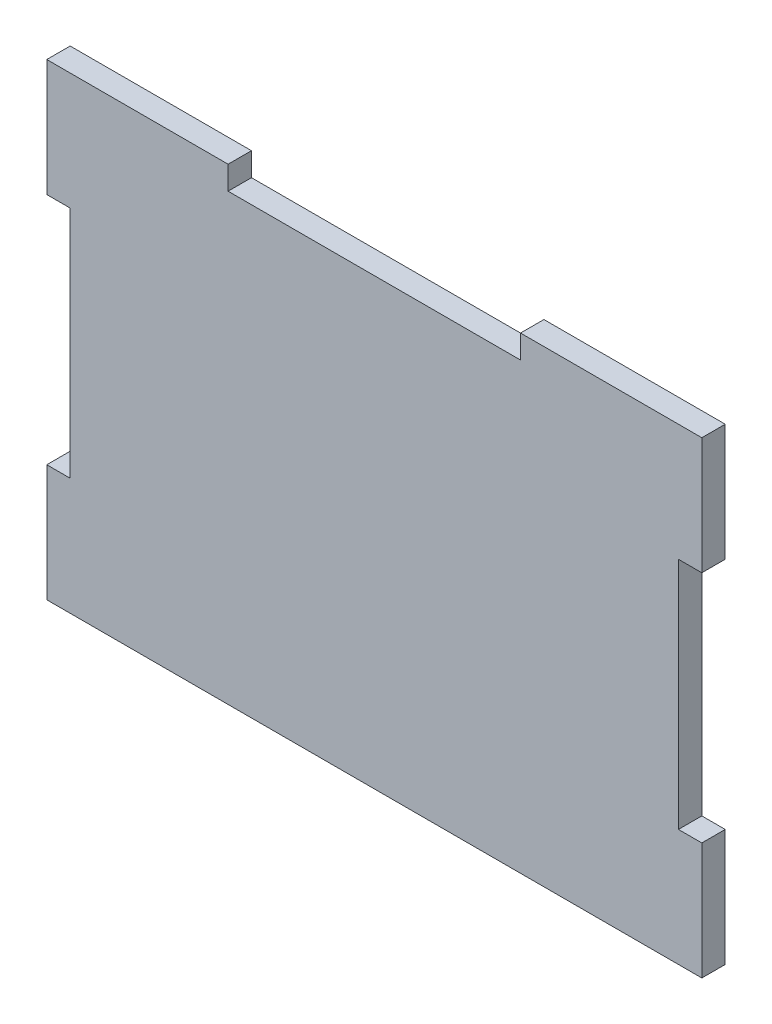
ISO-10303-21;
HEADER;
FILE_DESCRIPTION(('STEP AP214'),'2;1');
FILE_NAME('part.step','',(''),(''),'','','');
FILE_SCHEMA(('AUTOMOTIVE_DESIGN { 1 0 10303 214 1 1 1 1 }'));
ENDSEC;
DATA;
#1=APPLICATION_CONTEXT('core data for automotive mechanical design processes');
#2=APPLICATION_PROTOCOL_DEFINITION('international standard','automotive_design',2000,#1);
#3=PRODUCT_CONTEXT('',#1,'mechanical');
#4=PRODUCT('Part','Part','',(#3));
#5=PRODUCT_RELATED_PRODUCT_CATEGORY('part','',(#4));
#6=PRODUCT_DEFINITION_FORMATION('','',#4);
#7=PRODUCT_DEFINITION_CONTEXT('part definition',#1,'design');
#8=PRODUCT_DEFINITION('design','',#6,#7);
#9=PRODUCT_DEFINITION_SHAPE('','',#8);
#10=(LENGTH_UNIT() NAMED_UNIT(*) SI_UNIT(.MILLI.,.METRE.));
#11=(NAMED_UNIT(*) PLANE_ANGLE_UNIT() SI_UNIT($,.RADIAN.));
#12=(NAMED_UNIT(*) SI_UNIT($,.STERADIAN.) SOLID_ANGLE_UNIT());
#13=UNCERTAINTY_MEASURE_WITH_UNIT(LENGTH_MEASURE(1.E-05),#10,'distance_accuracy_value','');
#14=(GEOMETRIC_REPRESENTATION_CONTEXT(3) GLOBAL_UNCERTAINTY_ASSIGNED_CONTEXT((#13)) GLOBAL_UNIT_ASSIGNED_CONTEXT((#10,
#11,#12)) REPRESENTATION_CONTEXT('',''));
#15=CARTESIAN_POINT('',(0.,0.,0.));
#16=DIRECTION('',(0.,0.,1.));
#17=DIRECTION('',(1.,0.,0.));
#18=AXIS2_PLACEMENT_3D('',#15,#16,#17);
#19=CARTESIAN_POINT('',(-4.00000000000001,40.,4.));
#20=DIRECTION('',(1.,0.,0.));
#21=DIRECTION('',(0.,0.,-1.));
#22=AXIS2_PLACEMENT_3D('',#19,#20,#21);
#23=PLANE('',#22);
#24=DIRECTION('',(0.,0.,1.));
#25=VECTOR('',#24,1.);
#26=CARTESIAN_POINT('',(-4.00000000000001,-20.,0.));
#27=LINE('',#26,#25);
#28=CARTESIAN_POINT('',(-4.00000000000001,-20.,0.));
#29=VERTEX_POINT('',#28);
#30=CARTESIAN_POINT('',(-4.00000000000001,-20.,4.));
#31=VERTEX_POINT('',#30);
#32=EDGE_CURVE('E180',#29,#31,#27,.T.);
#33=ORIENTED_EDGE('',*,*,#32,.F.);
#34=DIRECTION('',(0.,-1.,0.));
#35=VECTOR('',#34,1.);
#36=CARTESIAN_POINT('',(-4.00000000000001,40.,0.));
#37=LINE('',#36,#35);
#38=CARTESIAN_POINT('',(-4.00000000000001,-40.,0.));
#39=VERTEX_POINT('',#38);
#40=EDGE_CURVE('E170',#29,#39,#37,.T.);
#41=ORIENTED_EDGE('',*,*,#40,.T.);
#42=DIRECTION('',(0.,0.,-1.));
#43=VECTOR('',#42,1.);
#44=CARTESIAN_POINT('',(-4.00000000000001,-40.,4.));
#45=LINE('',#44,#43);
#46=CARTESIAN_POINT('',(-4.00000000000001,-40.,4.));
#47=VERTEX_POINT('',#46);
#48=EDGE_CURVE('E11',#47,#39,#45,.T.);
#49=ORIENTED_EDGE('',*,*,#48,.F.);
#50=DIRECTION('',(0.,-1.,0.));
#51=VECTOR('',#50,1.);
#52=CARTESIAN_POINT('',(-4.00000000000001,40.,4.));
#53=LINE('',#52,#51);
#54=EDGE_CURVE('E236',#31,#47,#53,.T.);
#55=ORIENTED_EDGE('',*,*,#54,.F.);
#56=EDGE_LOOP('',(#33,#41,#49,#55));
#57=FACE_BOUND('',#56,.T.);
#58=ADVANCED_FACE('F36',(#57),#23,.F.);
#59=CARTESIAN_POINT('',(108.,40.,4.));
#60=DIRECTION('',(-1.,0.,0.));
#61=DIRECTION('',(0.,0.,1.));
#62=AXIS2_PLACEMENT_3D('',#59,#60,#61);
#63=PLANE('',#62);
#64=DIRECTION('',(0.,0.,1.));
#65=VECTOR('',#64,1.);
#66=CARTESIAN_POINT('',(108.,20.,0.));
#67=LINE('',#66,#65);
#68=CARTESIAN_POINT('',(108.,20.,0.));
#69=VERTEX_POINT('',#68);
#70=CARTESIAN_POINT('',(108.,20.,4.));
#71=VERTEX_POINT('',#70);
#72=EDGE_CURVE('E228',#69,#71,#67,.T.);
#73=ORIENTED_EDGE('',*,*,#72,.F.);
#74=DIRECTION('',(0.,1.,0.));
#75=VECTOR('',#74,1.);
#76=CARTESIAN_POINT('',(108.,40.,0.));
#77=LINE('',#76,#75);
#78=CARTESIAN_POINT('',(108.,40.,0.));
#79=VERTEX_POINT('',#78);
#80=EDGE_CURVE('E252',#69,#79,#77,.T.);
#81=ORIENTED_EDGE('',*,*,#80,.T.);
#82=DIRECTION('',(0.,0.,-1.));
#83=VECTOR('',#82,1.);
#84=CARTESIAN_POINT('',(108.,40.,4.));
#85=LINE('',#84,#83);
#86=CARTESIAN_POINT('',(108.,40.,4.));
#87=VERTEX_POINT('',#86);
#88=EDGE_CURVE('E262',#87,#79,#85,.T.);
#89=ORIENTED_EDGE('',*,*,#88,.F.);
#90=DIRECTION('',(0.,1.,0.));
#91=VECTOR('',#90,1.);
#92=CARTESIAN_POINT('',(108.,40.,4.));
#93=LINE('',#92,#91);
#94=EDGE_CURVE('E238',#71,#87,#93,.T.);
#95=ORIENTED_EDGE('',*,*,#94,.F.);
#96=EDGE_LOOP('',(#73,#81,#89,#95));
#97=FACE_BOUND('',#96,.T.);
#98=ADVANCED_FACE('F317',(#97),#63,.F.);
#99=CARTESIAN_POINT('',(-4.00000000000001,40.,4.));
#100=DIRECTION('',(0.,-1.,0.));
#101=DIRECTION('',(0.,0.,-1.));
#102=AXIS2_PLACEMENT_3D('',#99,#100,#101);
#103=PLANE('',#102);
#104=DIRECTION('',(0.,0.,1.));
#105=VECTOR('',#104,1.);
#106=CARTESIAN_POINT('',(26.9999999999995,40.,0.));
#107=LINE('',#106,#105);
#108=CARTESIAN_POINT('',(26.9999999999995,40.,0.));
#109=VERTEX_POINT('',#108);
#110=CARTESIAN_POINT('',(26.9999999999995,40.,4.));
#111=VERTEX_POINT('',#110);
#112=EDGE_CURVE('E205',#109,#111,#107,.T.);
#113=ORIENTED_EDGE('',*,*,#112,.F.);
#114=DIRECTION('',(-1.,0.,0.));
#115=VECTOR('',#114,1.);
#116=CARTESIAN_POINT('',(-4.00000000000001,40.,0.));
#117=LINE('',#116,#115);
#118=CARTESIAN_POINT('',(-4.00000000000001,40.,0.));
#119=VERTEX_POINT('',#118);
#120=EDGE_CURVE('E256',#109,#119,#117,.T.);
#121=ORIENTED_EDGE('',*,*,#120,.T.);
#122=DIRECTION('',(0.,0.,-1.));
#123=VECTOR('',#122,1.);
#124=CARTESIAN_POINT('',(-4.00000000000001,40.,4.));
#125=LINE('',#124,#123);
#126=CARTESIAN_POINT('',(-4.00000000000001,40.,4.));
#127=VERTEX_POINT('',#126);
#128=EDGE_CURVE('E246',#127,#119,#125,.T.);
#129=ORIENTED_EDGE('',*,*,#128,.F.);
#130=DIRECTION('',(-1.,0.,0.));
#131=VECTOR('',#130,1.);
#132=CARTESIAN_POINT('',(-4.00000000000001,40.,4.));
#133=LINE('',#132,#131);
#134=EDGE_CURVE('E242',#111,#127,#133,.T.);
#135=ORIENTED_EDGE('',*,*,#134,.F.);
#136=EDGE_LOOP('',(#113,#121,#129,#135));
#137=FACE_BOUND('',#136,.T.);
#138=ADVANCED_FACE('F296',(#137),#103,.F.);
#139=CARTESIAN_POINT('',(0.,0.,4.));
#140=DIRECTION('',(0.,0.,1.));
#141=DIRECTION('',(1.,0.,0.));
#142=AXIS2_PLACEMENT_3D('',#139,#140,#141);
#143=PLANE('',#142);
#144=DIRECTION('',(0.,-1.,0.));
#145=VECTOR('',#144,1.);
#146=CARTESIAN_POINT('',(0.,0.,4.));
#147=LINE('',#146,#145);
#148=CARTESIAN_POINT('',(0.,20.,4.));
#149=VERTEX_POINT('',#148);
#150=CARTESIAN_POINT('',(0.,-20.,4.));
#151=VERTEX_POINT('',#150);
#152=EDGE_CURVE('E173',#149,#151,#147,.T.);
#153=ORIENTED_EDGE('',*,*,#152,.T.);
#154=DIRECTION('',(-1.,0.,0.));
#155=VECTOR('',#154,1.);
#156=CARTESIAN_POINT('',(0.,-20.,4.));
#157=LINE('',#156,#155);
#158=EDGE_CURVE('E164',#151,#31,#157,.T.);
#159=ORIENTED_EDGE('',*,*,#158,.T.);
#160=ORIENTED_EDGE('',*,*,#54,.T.);
#161=DIRECTION('',(1.,0.,0.));
#162=VECTOR('',#161,1.);
#163=CARTESIAN_POINT('',(-4.00000000000001,-40.,4.));
#164=LINE('',#163,#162);
#165=CARTESIAN_POINT('',(108.,-40.,4.));
#166=VERTEX_POINT('',#165);
#167=EDGE_CURVE('E235',#47,#166,#164,.T.);
#168=ORIENTED_EDGE('',*,*,#167,.T.);
#169=CARTESIAN_POINT('',(108.,-20.,4.));
#170=VERTEX_POINT('',#169);
#171=EDGE_CURVE('E239',#166,#170,#93,.T.);
#172=ORIENTED_EDGE('',*,*,#171,.T.);
#173=DIRECTION('',(1.,0.,0.));
#174=VECTOR('',#173,1.);
#175=CARTESIAN_POINT('',(0.,-20.,4.));
#176=LINE('',#175,#174);
#177=CARTESIAN_POINT('',(104.,-20.,4.));
#178=VERTEX_POINT('',#177);
#179=EDGE_CURVE('E223',#178,#170,#176,.T.);
#180=ORIENTED_EDGE('',*,*,#179,.F.);
#181=DIRECTION('',(0.,-1.,0.));
#182=VECTOR('',#181,1.);
#183=CARTESIAN_POINT('',(104.,0.,4.));
#184=LINE('',#183,#182);
#185=CARTESIAN_POINT('',(104.,20.,4.));
#186=VERTEX_POINT('',#185);
#187=EDGE_CURVE('E220',#186,#178,#184,.T.);
#188=ORIENTED_EDGE('',*,*,#187,.F.);
#189=DIRECTION('',(1.,0.,0.));
#190=VECTOR('',#189,1.);
#191=CARTESIAN_POINT('',(0.,20.,4.));
#192=LINE('',#191,#190);
#193=EDGE_CURVE('E215',#186,#71,#192,.T.);
#194=ORIENTED_EDGE('',*,*,#193,.T.);
#195=ORIENTED_EDGE('',*,*,#94,.T.);
#196=CARTESIAN_POINT('',(76.9999999999997,40.,3.99999999999999));
#197=VERTEX_POINT('',#196);
#198=EDGE_CURVE('E243',#87,#197,#133,.T.);
#199=ORIENTED_EDGE('',*,*,#198,.T.);
#200=DIRECTION('',(0.,1.,0.));
#201=VECTOR('',#200,1.);
#202=CARTESIAN_POINT('',(76.9999999999997,0.,3.99999999999999));
#203=LINE('',#202,#201);
#204=CARTESIAN_POINT('',(76.9999999999997,36.,3.99999999999999));
#205=VERTEX_POINT('',#204);
#206=EDGE_CURVE('E199',#205,#197,#203,.T.);
#207=ORIENTED_EDGE('',*,*,#206,.F.);
#208=DIRECTION('',(1.,0.,0.));
#209=VECTOR('',#208,1.);
#210=CARTESIAN_POINT('',(0.,36.,4.));
#211=LINE('',#210,#209);
#212=CARTESIAN_POINT('',(26.9999999999995,36.,4.));
#213=VERTEX_POINT('',#212);
#214=EDGE_CURVE('E196',#213,#205,#211,.T.);
#215=ORIENTED_EDGE('',*,*,#214,.F.);
#216=DIRECTION('',(0.,1.,0.));
#217=VECTOR('',#216,1.);
#218=CARTESIAN_POINT('',(26.9999999999995,0.,4.));
#219=LINE('',#218,#217);
#220=EDGE_CURVE('E190',#213,#111,#219,.T.);
#221=ORIENTED_EDGE('',*,*,#220,.T.);
#222=ORIENTED_EDGE('',*,*,#134,.T.);
#223=CARTESIAN_POINT('',(-4.00000000000001,20.,4.));
#224=VERTEX_POINT('',#223);
#225=EDGE_CURVE('E232',#127,#224,#53,.T.);
#226=ORIENTED_EDGE('',*,*,#225,.T.);
#227=DIRECTION('',(-1.,0.,0.));
#228=VECTOR('',#227,1.);
#229=CARTESIAN_POINT('',(0.,20.,4.));
#230=LINE('',#229,#228);
#231=EDGE_CURVE('E171',#149,#224,#230,.T.);
#232=ORIENTED_EDGE('',*,*,#231,.F.);
#233=EDGE_LOOP('',(#153,#159,#160,#168,#172,#180,#188,#194,#195,#199,#207,#215,#221,#222,#226,#232));
#234=FACE_BOUND('',#233,.T.);
#235=ADVANCED_FACE('F281',(#234),#143,.T.);
#236=CARTESIAN_POINT('',(0.,0.,0.));
#237=DIRECTION('',(0.,0.,1.));
#238=DIRECTION('',(1.,0.,0.));
#239=AXIS2_PLACEMENT_3D('',#236,#237,#238);
#240=PLANE('',#239);
#241=DIRECTION('',(-1.,0.,0.));
#242=VECTOR('',#241,1.);
#243=CARTESIAN_POINT('',(0.,-20.,0.));
#244=LINE('',#243,#242);
#245=CARTESIAN_POINT('',(0.,-20.,0.));
#246=VERTEX_POINT('',#245);
#247=EDGE_CURVE('E158',#246,#29,#244,.T.);
#248=ORIENTED_EDGE('',*,*,#247,.F.);
#249=DIRECTION('',(0.,-1.,0.));
#250=VECTOR('',#249,1.);
#251=CARTESIAN_POINT('',(0.,0.,0.));
#252=LINE('',#251,#250);
#253=CARTESIAN_POINT('',(0.,20.,0.));
#254=VERTEX_POINT('',#253);
#255=EDGE_CURVE('E149',#254,#246,#252,.T.);
#256=ORIENTED_EDGE('',*,*,#255,.F.);
#257=DIRECTION('',(-1.,0.,0.));
#258=VECTOR('',#257,1.);
#259=CARTESIAN_POINT('',(0.,20.,0.));
#260=LINE('',#259,#258);
#261=CARTESIAN_POINT('',(-4.00000000000001,20.,0.));
#262=VERTEX_POINT('',#261);
#263=EDGE_CURVE('E51',#254,#262,#260,.T.);
#264=ORIENTED_EDGE('',*,*,#263,.T.);
#265=EDGE_CURVE('E247',#119,#262,#37,.T.);
#266=ORIENTED_EDGE('',*,*,#265,.F.);
#267=ORIENTED_EDGE('',*,*,#120,.F.);
#268=DIRECTION('',(0.,1.,0.));
#269=VECTOR('',#268,1.);
#270=CARTESIAN_POINT('',(26.9999999999995,0.,0.));
#271=LINE('',#270,#269);
#272=CARTESIAN_POINT('',(26.9999999999995,36.,0.));
#273=VERTEX_POINT('',#272);
#274=EDGE_CURVE('E193',#273,#109,#271,.T.);
#275=ORIENTED_EDGE('',*,*,#274,.F.);
#276=DIRECTION('',(1.,0.,0.));
#277=VECTOR('',#276,1.);
#278=CARTESIAN_POINT('',(0.,36.,0.));
#279=LINE('',#278,#277);
#280=CARTESIAN_POINT('',(76.9999999999997,36.,0.));
#281=VERTEX_POINT('',#280);
#282=EDGE_CURVE('E186',#273,#281,#279,.T.);
#283=ORIENTED_EDGE('',*,*,#282,.T.);
#284=DIRECTION('',(0.,1.,0.));
#285=VECTOR('',#284,1.);
#286=CARTESIAN_POINT('',(76.9999999999997,0.,0.));
#287=LINE('',#286,#285);
#288=CARTESIAN_POINT('',(76.9999999999997,40.,0.));
#289=VERTEX_POINT('',#288);
#290=EDGE_CURVE('E189',#281,#289,#287,.T.);
#291=ORIENTED_EDGE('',*,*,#290,.T.);
#292=EDGE_CURVE('E257',#79,#289,#117,.T.);
#293=ORIENTED_EDGE('',*,*,#292,.F.);
#294=ORIENTED_EDGE('',*,*,#80,.F.);
#295=DIRECTION('',(1.,0.,0.));
#296=VECTOR('',#295,1.);
#297=CARTESIAN_POINT('',(0.,20.,0.));
#298=LINE('',#297,#296);
#299=CARTESIAN_POINT('',(104.,20.,0.));
#300=VERTEX_POINT('',#299);
#301=EDGE_CURVE('E217',#300,#69,#298,.T.);
#302=ORIENTED_EDGE('',*,*,#301,.F.);
#303=DIRECTION('',(0.,-1.,0.));
#304=VECTOR('',#303,1.);
#305=CARTESIAN_POINT('',(104.,0.,0.));
#306=LINE('',#305,#304);
#307=CARTESIAN_POINT('',(104.,-20.,0.));
#308=VERTEX_POINT('',#307);
#309=EDGE_CURVE('E211',#300,#308,#306,.T.);
#310=ORIENTED_EDGE('',*,*,#309,.T.);
#311=DIRECTION('',(1.,0.,0.));
#312=VECTOR('',#311,1.);
#313=CARTESIAN_POINT('',(0.,-20.,0.));
#314=LINE('',#313,#312);
#315=CARTESIAN_POINT('',(108.,-20.,0.));
#316=VERTEX_POINT('',#315);
#317=EDGE_CURVE('E214',#308,#316,#314,.T.);
#318=ORIENTED_EDGE('',*,*,#317,.T.);
#319=CARTESIAN_POINT('',(108.,-40.,0.));
#320=VERTEX_POINT('',#319);
#321=EDGE_CURVE('E253',#320,#316,#77,.T.);
#322=ORIENTED_EDGE('',*,*,#321,.F.);
#323=DIRECTION('',(1.,0.,0.));
#324=VECTOR('',#323,1.);
#325=CARTESIAN_POINT('',(-4.00000000000001,-40.,0.));
#326=LINE('',#325,#324);
#327=EDGE_CURVE('E250',#39,#320,#326,.T.);
#328=ORIENTED_EDGE('',*,*,#327,.F.);
#329=ORIENTED_EDGE('',*,*,#40,.F.);
#330=EDGE_LOOP('',(#248,#256,#264,#266,#267,#275,#283,#291,#293,#294,#302,#310,#318,#322,#328,#329));
#331=FACE_BOUND('',#330,.T.);
#332=ADVANCED_FACE('F168',(#331),#240,.F.);
#333=ORIENTED_EDGE('',*,*,#265,.T.);
#334=DIRECTION('',(0.,0.,1.));
#335=VECTOR('',#334,1.);
#336=CARTESIAN_POINT('',(-4.00000000000001,20.,0.));
#337=LINE('',#336,#335);
#338=EDGE_CURVE('E182',#262,#224,#337,.T.);
#339=ORIENTED_EDGE('',*,*,#338,.T.);
#340=ORIENTED_EDGE('',*,*,#225,.F.);
#341=ORIENTED_EDGE('',*,*,#128,.T.);
#342=EDGE_LOOP('',(#333,#339,#340,#341));
#343=FACE_BOUND('',#342,.T.);
#344=ADVANCED_FACE('F38',(#343),#23,.F.);
#345=CARTESIAN_POINT('',(-4.00000000000001,-40.,4.));
#346=DIRECTION('',(0.,1.,0.));
#347=DIRECTION('',(0.,0.,1.));
#348=AXIS2_PLACEMENT_3D('',#345,#346,#347);
#349=PLANE('',#348);
#350=ORIENTED_EDGE('',*,*,#327,.T.);
#351=DIRECTION('',(0.,0.,-1.));
#352=VECTOR('',#351,1.);
#353=CARTESIAN_POINT('',(108.,-40.,4.));
#354=LINE('',#353,#352);
#355=EDGE_CURVE('E44',#166,#320,#354,.T.);
#356=ORIENTED_EDGE('',*,*,#355,.F.);
#357=ORIENTED_EDGE('',*,*,#167,.F.);
#358=ORIENTED_EDGE('',*,*,#48,.T.);
#359=EDGE_LOOP('',(#350,#356,#357,#358));
#360=FACE_BOUND('',#359,.T.);
#361=ADVANCED_FACE('F284',(#360),#349,.F.);
#362=ORIENTED_EDGE('',*,*,#321,.T.);
#363=DIRECTION('',(0.,0.,1.));
#364=VECTOR('',#363,1.);
#365=CARTESIAN_POINT('',(108.,-20.,0.));
#366=LINE('',#365,#364);
#367=EDGE_CURVE('E59',#316,#170,#366,.T.);
#368=ORIENTED_EDGE('',*,*,#367,.T.);
#369=ORIENTED_EDGE('',*,*,#171,.F.);
#370=ORIENTED_EDGE('',*,*,#355,.T.);
#371=EDGE_LOOP('',(#362,#368,#369,#370));
#372=FACE_BOUND('',#371,.T.);
#373=ADVANCED_FACE('F269',(#372),#63,.F.);
#374=ORIENTED_EDGE('',*,*,#292,.T.);
#375=DIRECTION('',(0.,0.,1.));
#376=VECTOR('',#375,1.);
#377=CARTESIAN_POINT('',(76.9999999999997,40.,0.));
#378=LINE('',#377,#376);
#379=EDGE_CURVE('E207',#289,#197,#378,.T.);
#380=ORIENTED_EDGE('',*,*,#379,.T.);
#381=ORIENTED_EDGE('',*,*,#198,.F.);
#382=ORIENTED_EDGE('',*,*,#88,.T.);
#383=EDGE_LOOP('',(#374,#380,#381,#382));
#384=FACE_BOUND('',#383,.T.);
#385=ADVANCED_FACE('F311',(#384),#103,.F.);
#386=CARTESIAN_POINT('',(104.,0.,0.));
#387=DIRECTION('',(-1.,0.,0.));
#388=DIRECTION('',(0.,0.,1.));
#389=AXIS2_PLACEMENT_3D('',#386,#387,#388);
#390=PLANE('',#389);
#391=ORIENTED_EDGE('',*,*,#187,.T.);
#392=DIRECTION('',(0.,0.,1.));
#393=VECTOR('',#392,1.);
#394=CARTESIAN_POINT('',(104.,-20.,0.));
#395=LINE('',#394,#393);
#396=EDGE_CURVE('E219',#308,#178,#395,.T.);
#397=ORIENTED_EDGE('',*,*,#396,.F.);
#398=ORIENTED_EDGE('',*,*,#309,.F.);
#399=DIRECTION('',(0.,0.,1.));
#400=VECTOR('',#399,1.);
#401=CARTESIAN_POINT('',(104.,20.,0.));
#402=LINE('',#401,#400);
#403=EDGE_CURVE('E200',#300,#186,#402,.T.);
#404=ORIENTED_EDGE('',*,*,#403,.T.);
#405=EDGE_LOOP('',(#391,#397,#398,#404));
#406=FACE_BOUND('',#405,.T.);
#407=ADVANCED_FACE('F278',(#406),#390,.F.);
#408=CARTESIAN_POINT('',(0.,20.,0.));
#409=DIRECTION('',(0.,-1.,0.));
#410=DIRECTION('',(0.,0.,-1.));
#411=AXIS2_PLACEMENT_3D('',#408,#409,#410);
#412=PLANE('',#411);
#413=ORIENTED_EDGE('',*,*,#193,.F.);
#414=ORIENTED_EDGE('',*,*,#403,.F.);
#415=ORIENTED_EDGE('',*,*,#301,.T.);
#416=ORIENTED_EDGE('',*,*,#72,.T.);
#417=EDGE_LOOP('',(#413,#414,#415,#416));
#418=FACE_BOUND('',#417,.T.);
#419=ADVANCED_FACE('F319',(#418),#412,.T.);
#420=CARTESIAN_POINT('',(0.,-20.,0.));
#421=DIRECTION('',(0.,-1.,0.));
#422=DIRECTION('',(0.,0.,-1.));
#423=AXIS2_PLACEMENT_3D('',#420,#421,#422);
#424=PLANE('',#423);
#425=ORIENTED_EDGE('',*,*,#179,.T.);
#426=ORIENTED_EDGE('',*,*,#367,.F.);
#427=ORIENTED_EDGE('',*,*,#317,.F.);
#428=ORIENTED_EDGE('',*,*,#396,.T.);
#429=EDGE_LOOP('',(#425,#426,#427,#428));
#430=FACE_BOUND('',#429,.T.);
#431=ADVANCED_FACE('F274',(#430),#424,.F.);
#432=CARTESIAN_POINT('',(0.,36.,0.));
#433=DIRECTION('',(0.,-1.,0.));
#434=DIRECTION('',(0.,0.,-1.));
#435=AXIS2_PLACEMENT_3D('',#432,#433,#434);
#436=PLANE('',#435);
#437=ORIENTED_EDGE('',*,*,#214,.T.);
#438=DIRECTION('',(0.,0.,1.));
#439=VECTOR('',#438,1.);
#440=CARTESIAN_POINT('',(76.9999999999997,36.,0.));
#441=LINE('',#440,#439);
#442=EDGE_CURVE('E195',#281,#205,#441,.T.);
#443=ORIENTED_EDGE('',*,*,#442,.F.);
#444=ORIENTED_EDGE('',*,*,#282,.F.);
#445=DIRECTION('',(0.,0.,1.));
#446=VECTOR('',#445,1.);
#447=CARTESIAN_POINT('',(26.9999999999995,36.,0.));
#448=LINE('',#447,#446);
#449=EDGE_CURVE('E178',#273,#213,#448,.T.);
#450=ORIENTED_EDGE('',*,*,#449,.T.);
#451=EDGE_LOOP('',(#437,#443,#444,#450));
#452=FACE_BOUND('',#451,.T.);
#453=ADVANCED_FACE('F304',(#452),#436,.F.);
#454=CARTESIAN_POINT('',(26.9999999999995,0.,0.));
#455=DIRECTION('',(1.,0.,0.));
#456=DIRECTION('',(0.,0.,-1.));
#457=AXIS2_PLACEMENT_3D('',#454,#455,#456);
#458=PLANE('',#457);
#459=ORIENTED_EDGE('',*,*,#220,.F.);
#460=ORIENTED_EDGE('',*,*,#449,.F.);
#461=ORIENTED_EDGE('',*,*,#274,.T.);
#462=ORIENTED_EDGE('',*,*,#112,.T.);
#463=EDGE_LOOP('',(#459,#460,#461,#462));
#464=FACE_BOUND('',#463,.T.);
#465=ADVANCED_FACE('F300',(#464),#458,.T.);
#466=CARTESIAN_POINT('',(76.9999999999997,0.,0.));
#467=DIRECTION('',(1.,0.,0.));
#468=DIRECTION('',(0.,0.,-1.));
#469=AXIS2_PLACEMENT_3D('',#466,#467,#468);
#470=PLANE('',#469);
#471=ORIENTED_EDGE('',*,*,#206,.T.);
#472=ORIENTED_EDGE('',*,*,#379,.F.);
#473=ORIENTED_EDGE('',*,*,#290,.F.);
#474=ORIENTED_EDGE('',*,*,#442,.T.);
#475=EDGE_LOOP('',(#471,#472,#473,#474));
#476=FACE_BOUND('',#475,.T.);
#477=ADVANCED_FACE('F390',(#476),#470,.F.);
#478=CARTESIAN_POINT('',(0.,-20.,0.));
#479=DIRECTION('',(0.,1.,0.));
#480=DIRECTION('',(0.,0.,1.));
#481=AXIS2_PLACEMENT_3D('',#478,#479,#480);
#482=PLANE('',#481);
#483=ORIENTED_EDGE('',*,*,#158,.F.);
#484=DIRECTION('',(0.,0.,1.));
#485=VECTOR('',#484,1.);
#486=CARTESIAN_POINT('',(0.,-20.,0.));
#487=LINE('',#486,#485);
#488=EDGE_CURVE('E153',#246,#151,#487,.T.);
#489=ORIENTED_EDGE('',*,*,#488,.F.);
#490=ORIENTED_EDGE('',*,*,#247,.T.);
#491=ORIENTED_EDGE('',*,*,#32,.T.);
#492=EDGE_LOOP('',(#483,#489,#490,#491));
#493=FACE_BOUND('',#492,.T.);
#494=ADVANCED_FACE('F161',(#493),#482,.T.);
#495=CARTESIAN_POINT('',(0.,20.,0.));
#496=DIRECTION('',(0.,1.,0.));
#497=DIRECTION('',(0.,0.,1.));
#498=AXIS2_PLACEMENT_3D('',#495,#496,#497);
#499=PLANE('',#498);
#500=ORIENTED_EDGE('',*,*,#231,.T.);
#501=ORIENTED_EDGE('',*,*,#338,.F.);
#502=ORIENTED_EDGE('',*,*,#263,.F.);
#503=DIRECTION('',(0.,0.,1.));
#504=VECTOR('',#503,1.);
#505=CARTESIAN_POINT('',(0.,20.,0.));
#506=LINE('',#505,#504);
#507=EDGE_CURVE('E155',#254,#149,#506,.T.);
#508=ORIENTED_EDGE('',*,*,#507,.T.);
#509=EDGE_LOOP('',(#500,#501,#502,#508));
#510=FACE_BOUND('',#509,.T.);
#511=ADVANCED_FACE('F288',(#510),#499,.F.);
#512=CARTESIAN_POINT('',(0.,0.,0.));
#513=DIRECTION('',(-1.,0.,0.));
#514=DIRECTION('',(0.,0.,1.));
#515=AXIS2_PLACEMENT_3D('',#512,#513,#514);
#516=PLANE('',#515);
#517=ORIENTED_EDGE('',*,*,#152,.F.);
#518=ORIENTED_EDGE('',*,*,#507,.F.);
#519=ORIENTED_EDGE('',*,*,#255,.T.);
#520=ORIENTED_EDGE('',*,*,#488,.T.);
#521=EDGE_LOOP('',(#517,#518,#519,#520));
#522=FACE_BOUND('',#521,.T.);
#523=ADVANCED_FACE('F152',(#522),#516,.T.);
#524=CLOSED_SHELL('',(#58,#98,#138,#235,#332,#344,#361,#373,#385,#407,#419,#431,#453,#465,#477,
#494,#511,#523));
#525=MANIFOLD_SOLID_BREP('B2',#524);
#526=ADVANCED_BREP_SHAPE_REPRESENTATION('',(#18,#525),#14);
#527=SHAPE_DEFINITION_REPRESENTATION(#9,#526);
ENDSEC;
END-ISO-10303-21;
